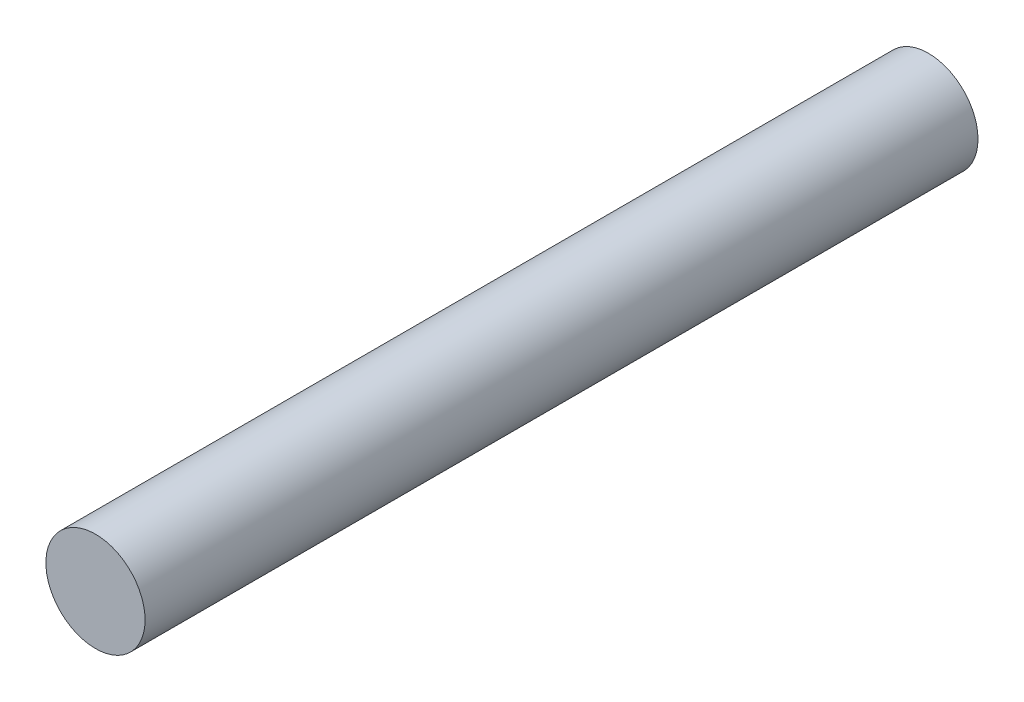
ISO-10303-21;
HEADER;
FILE_DESCRIPTION(('STEP AP214'),'2;1');
FILE_NAME('part.step','',(''),(''),'','','');
FILE_SCHEMA(('AUTOMOTIVE_DESIGN { 1 0 10303 214 1 1 1 1 }'));
ENDSEC;
DATA;
#1=APPLICATION_CONTEXT('core data for automotive mechanical design processes');
#2=APPLICATION_PROTOCOL_DEFINITION('international standard','automotive_design',2000,#1);
#3=PRODUCT_CONTEXT('',#1,'mechanical');
#4=PRODUCT('Part','Part','',(#3));
#5=PRODUCT_RELATED_PRODUCT_CATEGORY('part','',(#4));
#6=PRODUCT_DEFINITION_FORMATION('','',#4);
#7=PRODUCT_DEFINITION_CONTEXT('part definition',#1,'design');
#8=PRODUCT_DEFINITION('design','',#6,#7);
#9=PRODUCT_DEFINITION_SHAPE('','',#8);
#10=(LENGTH_UNIT() NAMED_UNIT(*) SI_UNIT(.MILLI.,.METRE.));
#11=(NAMED_UNIT(*) PLANE_ANGLE_UNIT() SI_UNIT($,.RADIAN.));
#12=(NAMED_UNIT(*) SI_UNIT($,.STERADIAN.) SOLID_ANGLE_UNIT());
#13=UNCERTAINTY_MEASURE_WITH_UNIT(LENGTH_MEASURE(1.E-05),#10,'distance_accuracy_value','');
#14=(GEOMETRIC_REPRESENTATION_CONTEXT(3) GLOBAL_UNCERTAINTY_ASSIGNED_CONTEXT((#13)) GLOBAL_UNIT_ASSIGNED_CONTEXT((#10,
#11,#12)) REPRESENTATION_CONTEXT('',''));
#15=CARTESIAN_POINT('',(0.,0.,0.));
#16=DIRECTION('',(0.,0.,1.));
#17=DIRECTION('',(1.,0.,0.));
#18=AXIS2_PLACEMENT_3D('',#15,#16,#17);
#19=CARTESIAN_POINT('',(0.,0.,80.));
#20=DIRECTION('',(0.,0.,-1.));
#21=DIRECTION('',(-1.,0.,0.));
#22=AXIS2_PLACEMENT_3D('',#19,#20,#21);
#23=CYLINDRICAL_SURFACE('',#22,4.7625);
#24=CARTESIAN_POINT('',(0.,0.,80.));
#25=DIRECTION('',(0.,0.,1.));
#26=DIRECTION('',(1.,0.,0.));
#27=AXIS2_PLACEMENT_3D('',#24,#25,#26);
#28=CIRCLE('',#27,4.7625);
#29=CARTESIAN_POINT('',(4.7625,0.,80.));
#30=VERTEX_POINT('',#29);
#31=EDGE_CURVE('E10',#30,#30,#28,.T.);
#32=ORIENTED_EDGE('',*,*,#31,.F.);
#33=EDGE_LOOP('',(#32));
#34=FACE_BOUND('',#33,.T.);
#35=CARTESIAN_POINT('',(0.,0.,0.));
#36=DIRECTION('',(0.,0.,1.));
#37=DIRECTION('',(1.,0.,0.));
#38=AXIS2_PLACEMENT_3D('',#35,#36,#37);
#39=CIRCLE('',#38,4.7625);
#40=CARTESIAN_POINT('',(4.7625,0.,0.));
#41=VERTEX_POINT('',#40);
#42=EDGE_CURVE('E38',#41,#41,#39,.T.);
#43=ORIENTED_EDGE('',*,*,#42,.T.);
#44=EDGE_LOOP('',(#43));
#45=FACE_BOUND('',#44,.T.);
#46=ADVANCED_FACE('F35',(#34,#45),#23,.T.);
#47=CARTESIAN_POINT('',(0.,0.,80.));
#48=DIRECTION('',(0.,0.,1.));
#49=DIRECTION('',(1.,0.,0.));
#50=AXIS2_PLACEMENT_3D('',#47,#48,#49);
#51=PLANE('',#50);
#52=ORIENTED_EDGE('',*,*,#31,.T.);
#53=EDGE_LOOP('',(#52));
#54=FACE_BOUND('',#53,.T.);
#55=ADVANCED_FACE('F50',(#54),#51,.T.);
#56=CARTESIAN_POINT('',(0.,0.,0.));
#57=DIRECTION('',(0.,0.,1.));
#58=DIRECTION('',(1.,0.,0.));
#59=AXIS2_PLACEMENT_3D('',#56,#57,#58);
#60=PLANE('',#59);
#61=ORIENTED_EDGE('',*,*,#42,.F.);
#62=EDGE_LOOP('',(#61));
#63=FACE_BOUND('',#62,.T.);
#64=ADVANCED_FACE('F48',(#63),#60,.F.);
#65=CLOSED_SHELL('',(#46,#55,#64));
#66=MANIFOLD_SOLID_BREP('B2',#65);
#67=ADVANCED_BREP_SHAPE_REPRESENTATION('',(#18,#66),#14);
#68=SHAPE_DEFINITION_REPRESENTATION(#9,#67);
ENDSEC;
END-ISO-10303-21;
